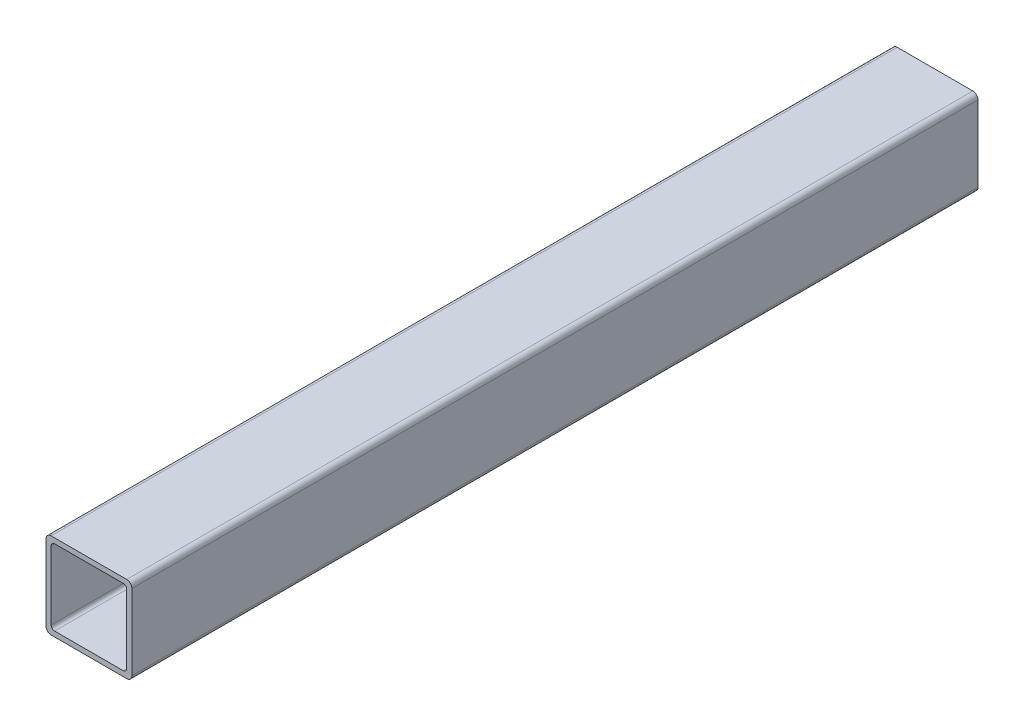
ISO-10303-21;
HEADER;
FILE_DESCRIPTION(('STEP AP214'),'2;1');
FILE_NAME('part.step','',(''),(''),'','','');
FILE_SCHEMA(('AUTOMOTIVE_DESIGN { 1 0 10303 214 1 1 1 1 }'));
ENDSEC;
DATA;
#1=APPLICATION_CONTEXT('core data for automotive mechanical design processes');
#2=APPLICATION_PROTOCOL_DEFINITION('international standard','automotive_design',2000,#1);
#3=PRODUCT_CONTEXT('',#1,'mechanical');
#4=PRODUCT('Part','Part','',(#3));
#5=PRODUCT_RELATED_PRODUCT_CATEGORY('part','',(#4));
#6=PRODUCT_DEFINITION_FORMATION('','',#4);
#7=PRODUCT_DEFINITION_CONTEXT('part definition',#1,'design');
#8=PRODUCT_DEFINITION('design','',#6,#7);
#9=PRODUCT_DEFINITION_SHAPE('','',#8);
#10=(LENGTH_UNIT() NAMED_UNIT(*) SI_UNIT(.MILLI.,.METRE.));
#11=(NAMED_UNIT(*) PLANE_ANGLE_UNIT() SI_UNIT($,.RADIAN.));
#12=(NAMED_UNIT(*) SI_UNIT($,.STERADIAN.) SOLID_ANGLE_UNIT());
#13=UNCERTAINTY_MEASURE_WITH_UNIT(LENGTH_MEASURE(1.E-05),#10,'distance_accuracy_value','');
#14=(GEOMETRIC_REPRESENTATION_CONTEXT(3) GLOBAL_UNCERTAINTY_ASSIGNED_CONTEXT((#13)) GLOBAL_UNIT_ASSIGNED_CONTEXT((#10,
#11,#12)) REPRESENTATION_CONTEXT('',''));
#15=CARTESIAN_POINT('',(0.,0.,0.));
#16=DIRECTION('',(0.,0.,1.));
#17=DIRECTION('',(1.,0.,0.));
#18=AXIS2_PLACEMENT_3D('',#15,#16,#17);
#19=CARTESIAN_POINT('',(-22.,3.,-492.500000000008));
#20=DIRECTION('',(0.,0.,1.));
#21=DIRECTION('',(1.,0.,0.));
#22=AXIS2_PLACEMENT_3D('',#19,#20,#21);
#23=CYLINDRICAL_SURFACE('',#22,3.);
#24=CARTESIAN_POINT('',(-22.,3.,0.));
#25=DIRECTION('',(0.,0.,1.));
#26=DIRECTION('',(1.,0.,0.));
#27=AXIS2_PLACEMENT_3D('',#24,#25,#26);
#28=CIRCLE('',#27,3.);
#29=CARTESIAN_POINT('',(-25.,3.,0.));
#30=VERTEX_POINT('',#29);
#31=CARTESIAN_POINT('',(-22.,0.,0.));
#32=VERTEX_POINT('',#31);
#33=EDGE_CURVE('E204',#30,#32,#28,.T.);
#34=ORIENTED_EDGE('',*,*,#33,.F.);
#35=DIRECTION('',(0.,0.,1.));
#36=VECTOR('',#35,1.);
#37=CARTESIAN_POINT('',(-25.,3.,-492.500000000008));
#38=LINE('',#37,#36);
#39=CARTESIAN_POINT('',(-25.,3.,-492.500000000008));
#40=VERTEX_POINT('',#39);
#41=EDGE_CURVE('E11',#40,#30,#38,.T.);
#42=ORIENTED_EDGE('',*,*,#41,.F.);
#43=CARTESIAN_POINT('',(-22.,3.,-492.500000000008));
#44=DIRECTION('',(0.,0.,1.));
#45=DIRECTION('',(1.,0.,0.));
#46=AXIS2_PLACEMENT_3D('',#43,#44,#45);
#47=CIRCLE('',#46,3.);
#48=CARTESIAN_POINT('',(-22.,0.,-492.500000000008));
#49=VERTEX_POINT('',#48);
#50=EDGE_CURVE('E216',#40,#49,#47,.T.);
#51=ORIENTED_EDGE('',*,*,#50,.T.);
#52=DIRECTION('',(0.,0.,1.));
#53=VECTOR('',#52,1.);
#54=CARTESIAN_POINT('',(-22.,0.,-492.500000000008));
#55=LINE('',#54,#53);
#56=EDGE_CURVE('E37',#49,#32,#55,.T.);
#57=ORIENTED_EDGE('',*,*,#56,.T.);
#58=EDGE_LOOP('',(#34,#42,#51,#57));
#59=FACE_BOUND('',#58,.T.);
#60=ADVANCED_FACE('F34',(#59),#23,.T.);
#61=CARTESIAN_POINT('',(-25.,47.,-492.500000000008));
#62=DIRECTION('',(-1.,0.,0.));
#63=DIRECTION('',(0.,0.,1.));
#64=AXIS2_PLACEMENT_3D('',#61,#62,#63);
#65=PLANE('',#64);
#66=DIRECTION('',(0.,-1.,0.));
#67=VECTOR('',#66,1.);
#68=CARTESIAN_POINT('',(-25.,47.,0.));
#69=LINE('',#68,#67);
#70=CARTESIAN_POINT('',(-25.,47.,0.));
#71=VERTEX_POINT('',#70);
#72=EDGE_CURVE('E220',#71,#30,#69,.T.);
#73=ORIENTED_EDGE('',*,*,#72,.F.);
#74=DIRECTION('',(0.,0.,1.));
#75=VECTOR('',#74,1.);
#76=CARTESIAN_POINT('',(-25.,47.,-492.500000000008));
#77=LINE('',#76,#75);
#78=CARTESIAN_POINT('',(-25.,47.,-492.500000000008));
#79=VERTEX_POINT('',#78);
#80=EDGE_CURVE('E42',#79,#71,#77,.T.);
#81=ORIENTED_EDGE('',*,*,#80,.F.);
#82=DIRECTION('',(0.,-1.,0.));
#83=VECTOR('',#82,1.);
#84=CARTESIAN_POINT('',(-25.,47.,-492.500000000008));
#85=LINE('',#84,#83);
#86=EDGE_CURVE('E238',#79,#40,#85,.T.);
#87=ORIENTED_EDGE('',*,*,#86,.T.);
#88=ORIENTED_EDGE('',*,*,#41,.T.);
#89=EDGE_LOOP('',(#73,#81,#87,#88));
#90=FACE_BOUND('',#89,.T.);
#91=ADVANCED_FACE('F285',(#90),#65,.T.);
#92=CARTESIAN_POINT('',(-22.,47.,-492.500000000008));
#93=DIRECTION('',(0.,0.,1.));
#94=DIRECTION('',(1.,0.,0.));
#95=AXIS2_PLACEMENT_3D('',#92,#93,#94);
#96=CYLINDRICAL_SURFACE('',#95,3.00000000000001);
#97=CARTESIAN_POINT('',(-22.,47.,0.));
#98=DIRECTION('',(0.,0.,1.));
#99=DIRECTION('',(1.,0.,0.));
#100=AXIS2_PLACEMENT_3D('',#97,#98,#99);
#101=CIRCLE('',#100,3.00000000000001);
#102=CARTESIAN_POINT('',(-22.,50.,0.));
#103=VERTEX_POINT('',#102);
#104=EDGE_CURVE('E258',#103,#71,#101,.T.);
#105=ORIENTED_EDGE('',*,*,#104,.F.);
#106=DIRECTION('',(0.,0.,1.));
#107=VECTOR('',#106,1.);
#108=CARTESIAN_POINT('',(-22.,50.,-492.500000000008));
#109=LINE('',#108,#107);
#110=CARTESIAN_POINT('',(-22.,50.,-492.500000000008));
#111=VERTEX_POINT('',#110);
#112=EDGE_CURVE('E264',#111,#103,#109,.T.);
#113=ORIENTED_EDGE('',*,*,#112,.F.);
#114=CARTESIAN_POINT('',(-22.,47.,-492.500000000008));
#115=DIRECTION('',(0.,0.,1.));
#116=DIRECTION('',(1.,0.,0.));
#117=AXIS2_PLACEMENT_3D('',#114,#115,#116);
#118=CIRCLE('',#117,3.00000000000001);
#119=EDGE_CURVE('E235',#111,#79,#118,.T.);
#120=ORIENTED_EDGE('',*,*,#119,.T.);
#121=ORIENTED_EDGE('',*,*,#80,.T.);
#122=EDGE_LOOP('',(#105,#113,#120,#121));
#123=FACE_BOUND('',#122,.T.);
#124=ADVANCED_FACE('F304',(#123),#96,.T.);
#125=CARTESIAN_POINT('',(-22.,50.,-492.500000000008));
#126=DIRECTION('',(0.,1.,0.));
#127=DIRECTION('',(0.,0.,1.));
#128=AXIS2_PLACEMENT_3D('',#125,#126,#127);
#129=PLANE('',#128);
#130=DIRECTION('',(-1.,0.,0.));
#131=VECTOR('',#130,1.);
#132=CARTESIAN_POINT('',(-22.,50.,0.));
#133=LINE('',#132,#131);
#134=CARTESIAN_POINT('',(22.,50.,0.));
#135=VERTEX_POINT('',#134);
#136=EDGE_CURVE('E255',#135,#103,#133,.T.);
#137=ORIENTED_EDGE('',*,*,#136,.F.);
#138=DIRECTION('',(0.,0.,1.));
#139=VECTOR('',#138,1.);
#140=CARTESIAN_POINT('',(22.,50.,-492.500000000008));
#141=LINE('',#140,#139);
#142=CARTESIAN_POINT('',(22.,50.,-492.500000000008));
#143=VERTEX_POINT('',#142);
#144=EDGE_CURVE('E266',#143,#135,#141,.T.);
#145=ORIENTED_EDGE('',*,*,#144,.F.);
#146=DIRECTION('',(-1.,0.,0.));
#147=VECTOR('',#146,1.);
#148=CARTESIAN_POINT('',(-22.,50.,-492.500000000008));
#149=LINE('',#148,#147);
#150=EDGE_CURVE('E232',#143,#111,#149,.T.);
#151=ORIENTED_EDGE('',*,*,#150,.T.);
#152=ORIENTED_EDGE('',*,*,#112,.T.);
#153=EDGE_LOOP('',(#137,#145,#151,#152));
#154=FACE_BOUND('',#153,.T.);
#155=ADVANCED_FACE('F302',(#154),#129,.T.);
#156=CARTESIAN_POINT('',(22.,47.,-492.500000000008));
#157=DIRECTION('',(0.,0.,1.));
#158=DIRECTION('',(1.,0.,0.));
#159=AXIS2_PLACEMENT_3D('',#156,#157,#158);
#160=CYLINDRICAL_SURFACE('',#159,3.00000000000001);
#161=CARTESIAN_POINT('',(22.,47.,0.));
#162=DIRECTION('',(0.,0.,1.));
#163=DIRECTION('',(-1.,0.,0.));
#164=AXIS2_PLACEMENT_3D('',#161,#162,#163);
#165=CIRCLE('',#164,3.00000000000001);
#166=CARTESIAN_POINT('',(25.,47.,0.));
#167=VERTEX_POINT('',#166);
#168=EDGE_CURVE('E252',#167,#135,#165,.T.);
#169=ORIENTED_EDGE('',*,*,#168,.F.);
#170=DIRECTION('',(0.,0.,1.));
#171=VECTOR('',#170,1.);
#172=CARTESIAN_POINT('',(25.,47.,-492.500000000008));
#173=LINE('',#172,#171);
#174=CARTESIAN_POINT('',(25.,47.,-492.500000000008));
#175=VERTEX_POINT('',#174);
#176=EDGE_CURVE('E268',#175,#167,#173,.T.);
#177=ORIENTED_EDGE('',*,*,#176,.F.);
#178=CARTESIAN_POINT('',(22.,47.,-492.500000000008));
#179=DIRECTION('',(0.,0.,1.));
#180=DIRECTION('',(-1.,0.,0.));
#181=AXIS2_PLACEMENT_3D('',#178,#179,#180);
#182=CIRCLE('',#181,3.00000000000001);
#183=EDGE_CURVE('E229',#175,#143,#182,.T.);
#184=ORIENTED_EDGE('',*,*,#183,.T.);
#185=ORIENTED_EDGE('',*,*,#144,.T.);
#186=EDGE_LOOP('',(#169,#177,#184,#185));
#187=FACE_BOUND('',#186,.T.);
#188=ADVANCED_FACE('F298',(#187),#160,.T.);
#189=CARTESIAN_POINT('',(25.,47.,-492.500000000008));
#190=DIRECTION('',(1.,0.,0.));
#191=DIRECTION('',(0.,0.,-1.));
#192=AXIS2_PLACEMENT_3D('',#189,#190,#191);
#193=PLANE('',#192);
#194=DIRECTION('',(0.,1.,0.));
#195=VECTOR('',#194,1.);
#196=CARTESIAN_POINT('',(25.,47.,0.));
#197=LINE('',#196,#195);
#198=CARTESIAN_POINT('',(25.,3.,0.));
#199=VERTEX_POINT('',#198);
#200=EDGE_CURVE('E249',#199,#167,#197,.T.);
#201=ORIENTED_EDGE('',*,*,#200,.F.);
#202=DIRECTION('',(0.,0.,1.));
#203=VECTOR('',#202,1.);
#204=CARTESIAN_POINT('',(25.,3.,-492.500000000008));
#205=LINE('',#204,#203);
#206=CARTESIAN_POINT('',(25.,3.,-492.500000000008));
#207=VERTEX_POINT('',#206);
#208=EDGE_CURVE('E270',#207,#199,#205,.T.);
#209=ORIENTED_EDGE('',*,*,#208,.F.);
#210=DIRECTION('',(0.,1.,0.));
#211=VECTOR('',#210,1.);
#212=CARTESIAN_POINT('',(25.,47.,-492.500000000008));
#213=LINE('',#212,#211);
#214=EDGE_CURVE('E226',#207,#175,#213,.T.);
#215=ORIENTED_EDGE('',*,*,#214,.T.);
#216=ORIENTED_EDGE('',*,*,#176,.T.);
#217=EDGE_LOOP('',(#201,#209,#215,#216));
#218=FACE_BOUND('',#217,.T.);
#219=ADVANCED_FACE('F296',(#218),#193,.T.);
#220=CARTESIAN_POINT('',(22.,3.,-492.500000000008));
#221=DIRECTION('',(0.,0.,1.));
#222=DIRECTION('',(1.,0.,0.));
#223=AXIS2_PLACEMENT_3D('',#220,#221,#222);
#224=CYLINDRICAL_SURFACE('',#223,3.);
#225=CARTESIAN_POINT('',(22.,3.,0.));
#226=DIRECTION('',(0.,0.,1.));
#227=DIRECTION('',(1.,0.,0.));
#228=AXIS2_PLACEMENT_3D('',#225,#226,#227);
#229=CIRCLE('',#228,3.);
#230=CARTESIAN_POINT('',(22.,0.,0.));
#231=VERTEX_POINT('',#230);
#232=EDGE_CURVE('E246',#231,#199,#229,.T.);
#233=ORIENTED_EDGE('',*,*,#232,.F.);
#234=DIRECTION('',(0.,0.,1.));
#235=VECTOR('',#234,1.);
#236=CARTESIAN_POINT('',(22.,0.,-492.500000000008));
#237=LINE('',#236,#235);
#238=CARTESIAN_POINT('',(22.,0.,-492.500000000008));
#239=VERTEX_POINT('',#238);
#240=EDGE_CURVE('E271',#239,#231,#237,.T.);
#241=ORIENTED_EDGE('',*,*,#240,.F.);
#242=CARTESIAN_POINT('',(22.,3.,-492.500000000008));
#243=DIRECTION('',(0.,0.,1.));
#244=DIRECTION('',(1.,0.,0.));
#245=AXIS2_PLACEMENT_3D('',#242,#243,#244);
#246=CIRCLE('',#245,3.);
#247=EDGE_CURVE('E223',#239,#207,#246,.T.);
#248=ORIENTED_EDGE('',*,*,#247,.T.);
#249=ORIENTED_EDGE('',*,*,#208,.T.);
#250=EDGE_LOOP('',(#233,#241,#248,#249));
#251=FACE_BOUND('',#250,.T.);
#252=ADVANCED_FACE('F292',(#251),#224,.T.);
#253=CARTESIAN_POINT('',(-22.,0.,-492.500000000008));
#254=DIRECTION('',(0.,-1.,0.));
#255=DIRECTION('',(0.,0.,-1.));
#256=AXIS2_PLACEMENT_3D('',#253,#254,#255);
#257=PLANE('',#256);
#258=DIRECTION('',(1.,0.,0.));
#259=VECTOR('',#258,1.);
#260=CARTESIAN_POINT('',(-22.,0.,0.));
#261=LINE('',#260,#259);
#262=EDGE_CURVE('E243',#32,#231,#261,.T.);
#263=ORIENTED_EDGE('',*,*,#262,.F.);
#264=ORIENTED_EDGE('',*,*,#56,.F.);
#265=DIRECTION('',(1.,0.,0.));
#266=VECTOR('',#265,1.);
#267=CARTESIAN_POINT('',(-22.,0.,-492.500000000008));
#268=LINE('',#267,#266);
#269=EDGE_CURVE('E219',#49,#239,#268,.T.);
#270=ORIENTED_EDGE('',*,*,#269,.T.);
#271=ORIENTED_EDGE('',*,*,#240,.T.);
#272=EDGE_LOOP('',(#263,#264,#270,#271));
#273=FACE_BOUND('',#272,.T.);
#274=ADVANCED_FACE('F279',(#273),#257,.T.);
#275=CARTESIAN_POINT('',(-22.,3.,-492.500000000008));
#276=DIRECTION('',(0.,0.,1.));
#277=DIRECTION('',(1.,0.,0.));
#278=AXIS2_PLACEMENT_3D('',#275,#276,#277);
#279=PLANE('',#278);
#280=DIRECTION('',(0.,-1.,0.));
#281=VECTOR('',#280,1.);
#282=CARTESIAN_POINT('',(-22.,45.,-492.500000000008));
#283=LINE('',#282,#281);
#284=CARTESIAN_POINT('',(-22.,45.,-492.500000000008));
#285=VERTEX_POINT('',#284);
#286=CARTESIAN_POINT('',(-22.,5.,-492.500000000008));
#287=VERTEX_POINT('',#286);
#288=EDGE_CURVE('E155',#285,#287,#283,.T.);
#289=ORIENTED_EDGE('',*,*,#288,.T.);
#290=CARTESIAN_POINT('',(-20.,5.,-492.500000000008));
#291=DIRECTION('',(0.,0.,1.));
#292=DIRECTION('',(1.,0.,0.));
#293=AXIS2_PLACEMENT_3D('',#290,#291,#292);
#294=CIRCLE('',#293,2.);
#295=CARTESIAN_POINT('',(-20.,3.,-492.500000000008));
#296=VERTEX_POINT('',#295);
#297=EDGE_CURVE('E149',#287,#296,#294,.T.);
#298=ORIENTED_EDGE('',*,*,#297,.T.);
#299=DIRECTION('',(1.,0.,0.));
#300=VECTOR('',#299,1.);
#301=CARTESIAN_POINT('',(-20.,3.,-492.500000000008));
#302=LINE('',#301,#300);
#303=CARTESIAN_POINT('',(20.,3.,-492.500000000008));
#304=VERTEX_POINT('',#303);
#305=EDGE_CURVE('E158',#296,#304,#302,.T.);
#306=ORIENTED_EDGE('',*,*,#305,.T.);
#307=CARTESIAN_POINT('',(20.,5.,-492.500000000008));
#308=DIRECTION('',(0.,0.,1.));
#309=DIRECTION('',(1.,0.,0.));
#310=AXIS2_PLACEMENT_3D('',#307,#308,#309);
#311=CIRCLE('',#310,2.);
#312=CARTESIAN_POINT('',(22.,5.,-492.500000000008));
#313=VERTEX_POINT('',#312);
#314=EDGE_CURVE('E50',#304,#313,#311,.T.);
#315=ORIENTED_EDGE('',*,*,#314,.T.);
#316=DIRECTION('',(0.,1.,0.));
#317=VECTOR('',#316,1.);
#318=CARTESIAN_POINT('',(22.,45.,-492.500000000008));
#319=LINE('',#318,#317);
#320=CARTESIAN_POINT('',(22.,45.,-492.500000000008));
#321=VERTEX_POINT('',#320);
#322=EDGE_CURVE('E173',#313,#321,#319,.T.);
#323=ORIENTED_EDGE('',*,*,#322,.T.);
#324=CARTESIAN_POINT('',(20.,45.,-492.500000000008));
#325=DIRECTION('',(0.,0.,1.));
#326=DIRECTION('',(-1.,0.,0.));
#327=AXIS2_PLACEMENT_3D('',#324,#325,#326);
#328=CIRCLE('',#327,2.);
#329=CARTESIAN_POINT('',(20.,47.,-492.500000000008));
#330=VERTEX_POINT('',#329);
#331=EDGE_CURVE('E176',#321,#330,#328,.T.);
#332=ORIENTED_EDGE('',*,*,#331,.T.);
#333=DIRECTION('',(-1.,0.,0.));
#334=VECTOR('',#333,1.);
#335=CARTESIAN_POINT('',(-20.,47.,-492.500000000008));
#336=LINE('',#335,#334);
#337=CARTESIAN_POINT('',(-20.,47.,-492.500000000008));
#338=VERTEX_POINT('',#337);
#339=EDGE_CURVE('E179',#330,#338,#336,.T.);
#340=ORIENTED_EDGE('',*,*,#339,.T.);
#341=CARTESIAN_POINT('',(-20.,45.,-492.500000000008));
#342=DIRECTION('',(0.,0.,1.));
#343=DIRECTION('',(1.,0.,0.));
#344=AXIS2_PLACEMENT_3D('',#341,#342,#343);
#345=CIRCLE('',#344,2.);
#346=EDGE_CURVE('E182',#338,#285,#345,.T.);
#347=ORIENTED_EDGE('',*,*,#346,.T.);
#348=EDGE_LOOP('',(#289,#298,#306,#315,#323,#332,#340,#347));
#349=FACE_BOUND('',#348,.T.);
#350=ORIENTED_EDGE('',*,*,#50,.F.);
#351=ORIENTED_EDGE('',*,*,#86,.F.);
#352=ORIENTED_EDGE('',*,*,#119,.F.);
#353=ORIENTED_EDGE('',*,*,#150,.F.);
#354=ORIENTED_EDGE('',*,*,#183,.F.);
#355=ORIENTED_EDGE('',*,*,#214,.F.);
#356=ORIENTED_EDGE('',*,*,#247,.F.);
#357=ORIENTED_EDGE('',*,*,#269,.F.);
#358=EDGE_LOOP('',(#350,#351,#352,#353,#354,#355,#356,#357));
#359=FACE_BOUND('',#358,.T.);
#360=ADVANCED_FACE('F162',(#349,#359),#279,.F.);
#361=CARTESIAN_POINT('',(-22.,3.,0.));
#362=DIRECTION('',(0.,0.,1.));
#363=DIRECTION('',(1.,0.,0.));
#364=AXIS2_PLACEMENT_3D('',#361,#362,#363);
#365=PLANE('',#364);
#366=CARTESIAN_POINT('',(-20.,5.,0.));
#367=DIRECTION('',(0.,0.,1.));
#368=DIRECTION('',(1.,0.,0.));
#369=AXIS2_PLACEMENT_3D('',#366,#367,#368);
#370=CIRCLE('',#369,2.);
#371=CARTESIAN_POINT('',(-22.,5.,0.));
#372=VERTEX_POINT('',#371);
#373=CARTESIAN_POINT('',(-20.,3.,0.));
#374=VERTEX_POINT('',#373);
#375=EDGE_CURVE('E58',#372,#374,#370,.T.);
#376=ORIENTED_EDGE('',*,*,#375,.F.);
#377=DIRECTION('',(0.,-1.,0.));
#378=VECTOR('',#377,1.);
#379=CARTESIAN_POINT('',(-22.,45.,0.));
#380=LINE('',#379,#378);
#381=CARTESIAN_POINT('',(-22.,45.,0.));
#382=VERTEX_POINT('',#381);
#383=EDGE_CURVE('E166',#382,#372,#380,.T.);
#384=ORIENTED_EDGE('',*,*,#383,.F.);
#385=CARTESIAN_POINT('',(-20.,45.,0.));
#386=DIRECTION('',(0.,0.,1.));
#387=DIRECTION('',(1.,0.,0.));
#388=AXIS2_PLACEMENT_3D('',#385,#386,#387);
#389=CIRCLE('',#388,2.);
#390=CARTESIAN_POINT('',(-20.,47.,0.));
#391=VERTEX_POINT('',#390);
#392=EDGE_CURVE('E169',#391,#382,#389,.T.);
#393=ORIENTED_EDGE('',*,*,#392,.F.);
#394=DIRECTION('',(-1.,0.,0.));
#395=VECTOR('',#394,1.);
#396=CARTESIAN_POINT('',(-20.,47.,0.));
#397=LINE('',#396,#395);
#398=CARTESIAN_POINT('',(20.,47.,0.));
#399=VERTEX_POINT('',#398);
#400=EDGE_CURVE('E197',#399,#391,#397,.T.);
#401=ORIENTED_EDGE('',*,*,#400,.F.);
#402=CARTESIAN_POINT('',(20.,45.,0.));
#403=DIRECTION('',(0.,0.,1.));
#404=DIRECTION('',(-1.,0.,0.));
#405=AXIS2_PLACEMENT_3D('',#402,#403,#404);
#406=CIRCLE('',#405,2.);
#407=CARTESIAN_POINT('',(22.,45.,0.));
#408=VERTEX_POINT('',#407);
#409=EDGE_CURVE('E194',#408,#399,#406,.T.);
#410=ORIENTED_EDGE('',*,*,#409,.F.);
#411=DIRECTION('',(0.,1.,0.));
#412=VECTOR('',#411,1.);
#413=CARTESIAN_POINT('',(22.,45.,0.));
#414=LINE('',#413,#412);
#415=CARTESIAN_POINT('',(22.,5.,0.));
#416=VERTEX_POINT('',#415);
#417=EDGE_CURVE('E191',#416,#408,#414,.T.);
#418=ORIENTED_EDGE('',*,*,#417,.F.);
#419=CARTESIAN_POINT('',(20.,5.,0.));
#420=DIRECTION('',(0.,0.,1.));
#421=DIRECTION('',(1.,0.,0.));
#422=AXIS2_PLACEMENT_3D('',#419,#420,#421);
#423=CIRCLE('',#422,2.);
#424=CARTESIAN_POINT('',(20.,3.,0.));
#425=VERTEX_POINT('',#424);
#426=EDGE_CURVE('E188',#425,#416,#423,.T.);
#427=ORIENTED_EDGE('',*,*,#426,.F.);
#428=DIRECTION('',(1.,0.,0.));
#429=VECTOR('',#428,1.);
#430=CARTESIAN_POINT('',(-20.,3.,0.));
#431=LINE('',#430,#429);
#432=EDGE_CURVE('E186',#374,#425,#431,.T.);
#433=ORIENTED_EDGE('',*,*,#432,.F.);
#434=EDGE_LOOP('',(#376,#384,#393,#401,#410,#418,#427,#433));
#435=FACE_BOUND('',#434,.T.);
#436=ORIENTED_EDGE('',*,*,#33,.T.);
#437=ORIENTED_EDGE('',*,*,#262,.T.);
#438=ORIENTED_EDGE('',*,*,#232,.T.);
#439=ORIENTED_EDGE('',*,*,#200,.T.);
#440=ORIENTED_EDGE('',*,*,#168,.T.);
#441=ORIENTED_EDGE('',*,*,#136,.T.);
#442=ORIENTED_EDGE('',*,*,#104,.T.);
#443=ORIENTED_EDGE('',*,*,#72,.T.);
#444=EDGE_LOOP('',(#436,#437,#438,#439,#440,#441,#442,#443));
#445=FACE_BOUND('',#444,.T.);
#446=ADVANCED_FACE('F281',(#435,#445),#365,.T.);
#447=CARTESIAN_POINT('',(-20.,5.,-492.500000000008));
#448=DIRECTION('',(0.,0.,1.));
#449=DIRECTION('',(1.,0.,0.));
#450=AXIS2_PLACEMENT_3D('',#447,#448,#449);
#451=CYLINDRICAL_SURFACE('',#450,2.);
#452=ORIENTED_EDGE('',*,*,#375,.T.);
#453=DIRECTION('',(0.,0.,1.));
#454=VECTOR('',#453,1.);
#455=CARTESIAN_POINT('',(-20.,3.,-492.500000000008));
#456=LINE('',#455,#454);
#457=EDGE_CURVE('E145',#296,#374,#456,.T.);
#458=ORIENTED_EDGE('',*,*,#457,.F.);
#459=ORIENTED_EDGE('',*,*,#297,.F.);
#460=DIRECTION('',(0.,0.,1.));
#461=VECTOR('',#460,1.);
#462=CARTESIAN_POINT('',(-22.,5.,-492.500000000008));
#463=LINE('',#462,#461);
#464=EDGE_CURVE('E202',#287,#372,#463,.T.);
#465=ORIENTED_EDGE('',*,*,#464,.T.);
#466=EDGE_LOOP('',(#452,#458,#459,#465));
#467=FACE_BOUND('',#466,.T.);
#468=ADVANCED_FACE('F147',(#467),#451,.F.);
#469=CARTESIAN_POINT('',(-22.,45.,-492.500000000008));
#470=DIRECTION('',(-1.,0.,0.));
#471=DIRECTION('',(0.,0.,1.));
#472=AXIS2_PLACEMENT_3D('',#469,#470,#471);
#473=PLANE('',#472);
#474=ORIENTED_EDGE('',*,*,#383,.T.);
#475=ORIENTED_EDGE('',*,*,#464,.F.);
#476=ORIENTED_EDGE('',*,*,#288,.F.);
#477=DIRECTION('',(0.,0.,1.));
#478=VECTOR('',#477,1.);
#479=CARTESIAN_POINT('',(-22.,45.,-492.500000000008));
#480=LINE('',#479,#478);
#481=EDGE_CURVE('E205',#285,#382,#480,.T.);
#482=ORIENTED_EDGE('',*,*,#481,.T.);
#483=EDGE_LOOP('',(#474,#475,#476,#482));
#484=FACE_BOUND('',#483,.T.);
#485=ADVANCED_FACE('F387',(#484),#473,.F.);
#486=CARTESIAN_POINT('',(-20.,45.,-492.500000000008));
#487=DIRECTION('',(0.,0.,1.));
#488=DIRECTION('',(1.,0.,0.));
#489=AXIS2_PLACEMENT_3D('',#486,#487,#488);
#490=CYLINDRICAL_SURFACE('',#489,2.);
#491=ORIENTED_EDGE('',*,*,#392,.T.);
#492=ORIENTED_EDGE('',*,*,#481,.F.);
#493=ORIENTED_EDGE('',*,*,#346,.F.);
#494=DIRECTION('',(0.,0.,1.));
#495=VECTOR('',#494,1.);
#496=CARTESIAN_POINT('',(-20.,47.,-492.500000000008));
#497=LINE('',#496,#495);
#498=EDGE_CURVE('E207',#338,#391,#497,.T.);
#499=ORIENTED_EDGE('',*,*,#498,.T.);
#500=EDGE_LOOP('',(#491,#492,#493,#499));
#501=FACE_BOUND('',#500,.T.);
#502=ADVANCED_FACE('F396',(#501),#490,.F.);
#503=CARTESIAN_POINT('',(-20.,47.,-492.500000000008));
#504=DIRECTION('',(0.,1.,0.));
#505=DIRECTION('',(0.,0.,1.));
#506=AXIS2_PLACEMENT_3D('',#503,#504,#505);
#507=PLANE('',#506);
#508=ORIENTED_EDGE('',*,*,#400,.T.);
#509=ORIENTED_EDGE('',*,*,#498,.F.);
#510=ORIENTED_EDGE('',*,*,#339,.F.);
#511=DIRECTION('',(0.,0.,1.));
#512=VECTOR('',#511,1.);
#513=CARTESIAN_POINT('',(20.,47.,-492.500000000008));
#514=LINE('',#513,#512);
#515=EDGE_CURVE('E209',#330,#399,#514,.T.);
#516=ORIENTED_EDGE('',*,*,#515,.T.);
#517=EDGE_LOOP('',(#508,#509,#510,#516));
#518=FACE_BOUND('',#517,.T.);
#519=ADVANCED_FACE('F406',(#518),#507,.F.);
#520=CARTESIAN_POINT('',(20.,45.,-492.500000000008));
#521=DIRECTION('',(0.,0.,1.));
#522=DIRECTION('',(1.,0.,0.));
#523=AXIS2_PLACEMENT_3D('',#520,#521,#522);
#524=CYLINDRICAL_SURFACE('',#523,2.);
#525=ORIENTED_EDGE('',*,*,#409,.T.);
#526=ORIENTED_EDGE('',*,*,#515,.F.);
#527=ORIENTED_EDGE('',*,*,#331,.F.);
#528=DIRECTION('',(0.,0.,1.));
#529=VECTOR('',#528,1.);
#530=CARTESIAN_POINT('',(22.,45.,-492.500000000008));
#531=LINE('',#530,#529);
#532=EDGE_CURVE('E211',#321,#408,#531,.T.);
#533=ORIENTED_EDGE('',*,*,#532,.T.);
#534=EDGE_LOOP('',(#525,#526,#527,#533));
#535=FACE_BOUND('',#534,.T.);
#536=ADVANCED_FACE('F416',(#535),#524,.F.);
#537=CARTESIAN_POINT('',(22.,45.,-492.500000000008));
#538=DIRECTION('',(1.,0.,0.));
#539=DIRECTION('',(0.,0.,-1.));
#540=AXIS2_PLACEMENT_3D('',#537,#538,#539);
#541=PLANE('',#540);
#542=ORIENTED_EDGE('',*,*,#417,.T.);
#543=ORIENTED_EDGE('',*,*,#532,.F.);
#544=ORIENTED_EDGE('',*,*,#322,.F.);
#545=DIRECTION('',(0.,0.,1.));
#546=VECTOR('',#545,1.);
#547=CARTESIAN_POINT('',(22.,5.,-492.500000000008));
#548=LINE('',#547,#546);
#549=EDGE_CURVE('E213',#313,#416,#548,.T.);
#550=ORIENTED_EDGE('',*,*,#549,.T.);
#551=EDGE_LOOP('',(#542,#543,#544,#550));
#552=FACE_BOUND('',#551,.T.);
#553=ADVANCED_FACE('F426',(#552),#541,.F.);
#554=CARTESIAN_POINT('',(20.,5.,-492.500000000008));
#555=DIRECTION('',(0.,0.,1.));
#556=DIRECTION('',(1.,0.,0.));
#557=AXIS2_PLACEMENT_3D('',#554,#555,#556);
#558=CYLINDRICAL_SURFACE('',#557,2.);
#559=ORIENTED_EDGE('',*,*,#426,.T.);
#560=ORIENTED_EDGE('',*,*,#549,.F.);
#561=ORIENTED_EDGE('',*,*,#314,.F.);
#562=DIRECTION('',(0.,0.,1.));
#563=VECTOR('',#562,1.);
#564=CARTESIAN_POINT('',(20.,3.,-492.500000000008));
#565=LINE('',#564,#563);
#566=EDGE_CURVE('E154',#304,#425,#565,.T.);
#567=ORIENTED_EDGE('',*,*,#566,.T.);
#568=EDGE_LOOP('',(#559,#560,#561,#567));
#569=FACE_BOUND('',#568,.T.);
#570=ADVANCED_FACE('F436',(#569),#558,.F.);
#571=CARTESIAN_POINT('',(-20.,3.,-492.500000000008));
#572=DIRECTION('',(0.,-1.,0.));
#573=DIRECTION('',(0.,0.,-1.));
#574=AXIS2_PLACEMENT_3D('',#571,#572,#573);
#575=PLANE('',#574);
#576=ORIENTED_EDGE('',*,*,#432,.T.);
#577=ORIENTED_EDGE('',*,*,#566,.F.);
#578=ORIENTED_EDGE('',*,*,#305,.F.);
#579=ORIENTED_EDGE('',*,*,#457,.T.);
#580=EDGE_LOOP('',(#576,#577,#578,#579));
#581=FACE_BOUND('',#580,.T.);
#582=ADVANCED_FACE('F159',(#581),#575,.F.);
#583=CLOSED_SHELL('',(#60,#91,#124,#155,#188,#219,#252,#274,#360,#446,#468,#485,#502,#519,#536,
#553,#570,#582));
#584=MANIFOLD_SOLID_BREP('B2',#583);
#585=ADVANCED_BREP_SHAPE_REPRESENTATION('',(#18,#584),#14);
#586=SHAPE_DEFINITION_REPRESENTATION(#9,#585);
ENDSEC;
END-ISO-10303-21;
